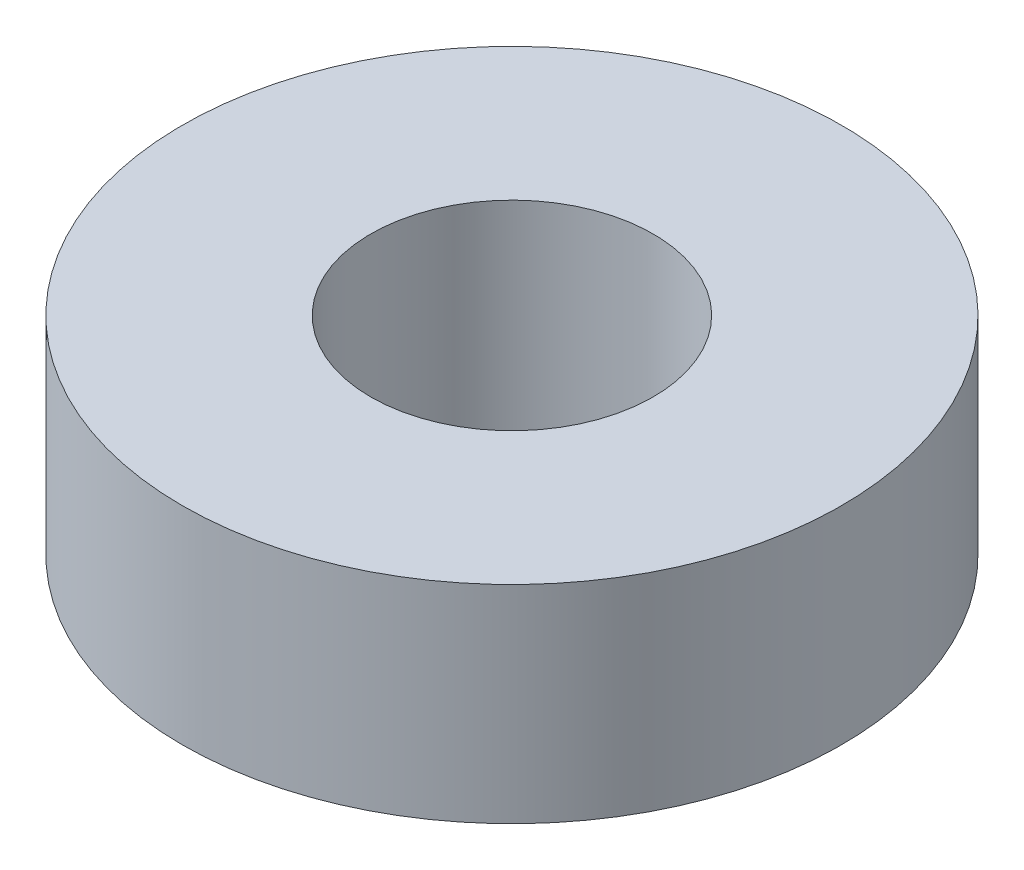
ISO-10303-21;
HEADER;
FILE_DESCRIPTION(('STEP AP214'),'2;1');
FILE_NAME('part.step','',(''),(''),'','','');
FILE_SCHEMA(('AUTOMOTIVE_DESIGN { 1 0 10303 214 1 1 1 1 }'));
ENDSEC;
DATA;
#1=APPLICATION_CONTEXT('core data for automotive mechanical design processes');
#2=APPLICATION_PROTOCOL_DEFINITION('international standard','automotive_design',2000,#1);
#3=PRODUCT_CONTEXT('',#1,'mechanical');
#4=PRODUCT('Part','Part','',(#3));
#5=PRODUCT_RELATED_PRODUCT_CATEGORY('part','',(#4));
#6=PRODUCT_DEFINITION_FORMATION('','',#4);
#7=PRODUCT_DEFINITION_CONTEXT('part definition',#1,'design');
#8=PRODUCT_DEFINITION('design','',#6,#7);
#9=PRODUCT_DEFINITION_SHAPE('','',#8);
#10=(LENGTH_UNIT() NAMED_UNIT(*) SI_UNIT(.MILLI.,.METRE.));
#11=(NAMED_UNIT(*) PLANE_ANGLE_UNIT() SI_UNIT($,.RADIAN.));
#12=(NAMED_UNIT(*) SI_UNIT($,.STERADIAN.) SOLID_ANGLE_UNIT());
#13=UNCERTAINTY_MEASURE_WITH_UNIT(LENGTH_MEASURE(1.E-05),#10,'distance_accuracy_value','');
#14=(GEOMETRIC_REPRESENTATION_CONTEXT(3) GLOBAL_UNCERTAINTY_ASSIGNED_CONTEXT((#13)) GLOBAL_UNIT_ASSIGNED_CONTEXT((#10,
#11,#12)) REPRESENTATION_CONTEXT('',''));
#15=CARTESIAN_POINT('',(0.,0.,0.));
#16=DIRECTION('',(0.,0.,1.));
#17=DIRECTION('',(1.,0.,0.));
#18=AXIS2_PLACEMENT_3D('',#15,#16,#17);
#19=CARTESIAN_POINT('',(0.,11.,0.));
#20=DIRECTION('',(0.,1.,0.));
#21=DIRECTION('',(0.,0.,1.));
#22=AXIS2_PLACEMENT_3D('',#19,#20,#21);
#23=PLANE('',#22);
#24=CARTESIAN_POINT('',(0.,11.,0.));
#25=DIRECTION('',(0.,1.,0.));
#26=DIRECTION('',(0.,0.,1.));
#27=AXIS2_PLACEMENT_3D('',#24,#25,#26);
#28=CIRCLE('',#27,17.5);
#29=CARTESIAN_POINT('',(0.,11.,17.5));
#30=VERTEX_POINT('',#29);
#31=EDGE_CURVE('E10',#30,#30,#28,.T.);
#32=ORIENTED_EDGE('',*,*,#31,.T.);
#33=EDGE_LOOP('',(#32));
#34=FACE_BOUND('',#33,.T.);
#35=CARTESIAN_POINT('',(0.,11.,0.));
#36=DIRECTION('',(0.,1.,0.));
#37=DIRECTION('',(0.,0.,1.));
#38=AXIS2_PLACEMENT_3D('',#35,#36,#37);
#39=CIRCLE('',#38,7.5);
#40=CARTESIAN_POINT('',(0.,11.,7.5));
#41=VERTEX_POINT('',#40);
#42=EDGE_CURVE('E43',#41,#41,#39,.T.);
#43=ORIENTED_EDGE('',*,*,#42,.F.);
#44=EDGE_LOOP('',(#43));
#45=FACE_BOUND('',#44,.T.);
#46=ADVANCED_FACE('F32',(#34,#45),#23,.T.);
#47=CARTESIAN_POINT('',(0.,0.,0.));
#48=DIRECTION('',(0.,1.,0.));
#49=DIRECTION('',(0.,0.,1.));
#50=AXIS2_PLACEMENT_3D('',#47,#48,#49);
#51=PLANE('',#50);
#52=CARTESIAN_POINT('',(0.,0.,0.));
#53=DIRECTION('',(0.,1.,0.));
#54=DIRECTION('',(0.,0.,1.));
#55=AXIS2_PLACEMENT_3D('',#52,#53,#54);
#56=CIRCLE('',#55,17.5);
#57=CARTESIAN_POINT('',(0.,0.,17.5));
#58=VERTEX_POINT('',#57);
#59=EDGE_CURVE('E36',#58,#58,#56,.T.);
#60=ORIENTED_EDGE('',*,*,#59,.F.);
#61=EDGE_LOOP('',(#60));
#62=FACE_BOUND('',#61,.T.);
#63=CARTESIAN_POINT('',(0.,0.,0.));
#64=DIRECTION('',(0.,1.,0.));
#65=DIRECTION('',(0.,0.,1.));
#66=AXIS2_PLACEMENT_3D('',#63,#64,#65);
#67=CIRCLE('',#66,7.5);
#68=CARTESIAN_POINT('',(0.,0.,7.5));
#69=VERTEX_POINT('',#68);
#70=EDGE_CURVE('E45',#69,#69,#67,.T.);
#71=ORIENTED_EDGE('',*,*,#70,.T.);
#72=EDGE_LOOP('',(#71));
#73=FACE_BOUND('',#72,.T.);
#74=ADVANCED_FACE('F55',(#62,#73),#51,.F.);
#75=CARTESIAN_POINT('',(0.,11.,0.));
#76=DIRECTION('',(0.,-1.,0.));
#77=DIRECTION('',(0.,0.,-1.));
#78=AXIS2_PLACEMENT_3D('',#75,#76,#77);
#79=CYLINDRICAL_SURFACE('',#78,17.5);
#80=ORIENTED_EDGE('',*,*,#31,.F.);
#81=EDGE_LOOP('',(#80));
#82=FACE_BOUND('',#81,.T.);
#83=ORIENTED_EDGE('',*,*,#59,.T.);
#84=EDGE_LOOP('',(#83));
#85=FACE_BOUND('',#84,.T.);
#86=ADVANCED_FACE('F34',(#82,#85),#79,.T.);
#87=CARTESIAN_POINT('',(0.,11.,0.));
#88=DIRECTION('',(0.,-1.,0.));
#89=DIRECTION('',(0.,0.,-1.));
#90=AXIS2_PLACEMENT_3D('',#87,#88,#89);
#91=CYLINDRICAL_SURFACE('',#90,7.5);
#92=ORIENTED_EDGE('',*,*,#42,.T.);
#93=EDGE_LOOP('',(#92));
#94=FACE_BOUND('',#93,.T.);
#95=ORIENTED_EDGE('',*,*,#70,.F.);
#96=EDGE_LOOP('',(#95));
#97=FACE_BOUND('',#96,.T.);
#98=ADVANCED_FACE('F51',(#94,#97),#91,.F.);
#99=CLOSED_SHELL('',(#46,#74,#86,#98));
#100=MANIFOLD_SOLID_BREP('B2',#99);
#101=ADVANCED_BREP_SHAPE_REPRESENTATION('',(#18,#100),#14);
#102=SHAPE_DEFINITION_REPRESENTATION(#9,#101);
ENDSEC;
END-ISO-10303-21;
